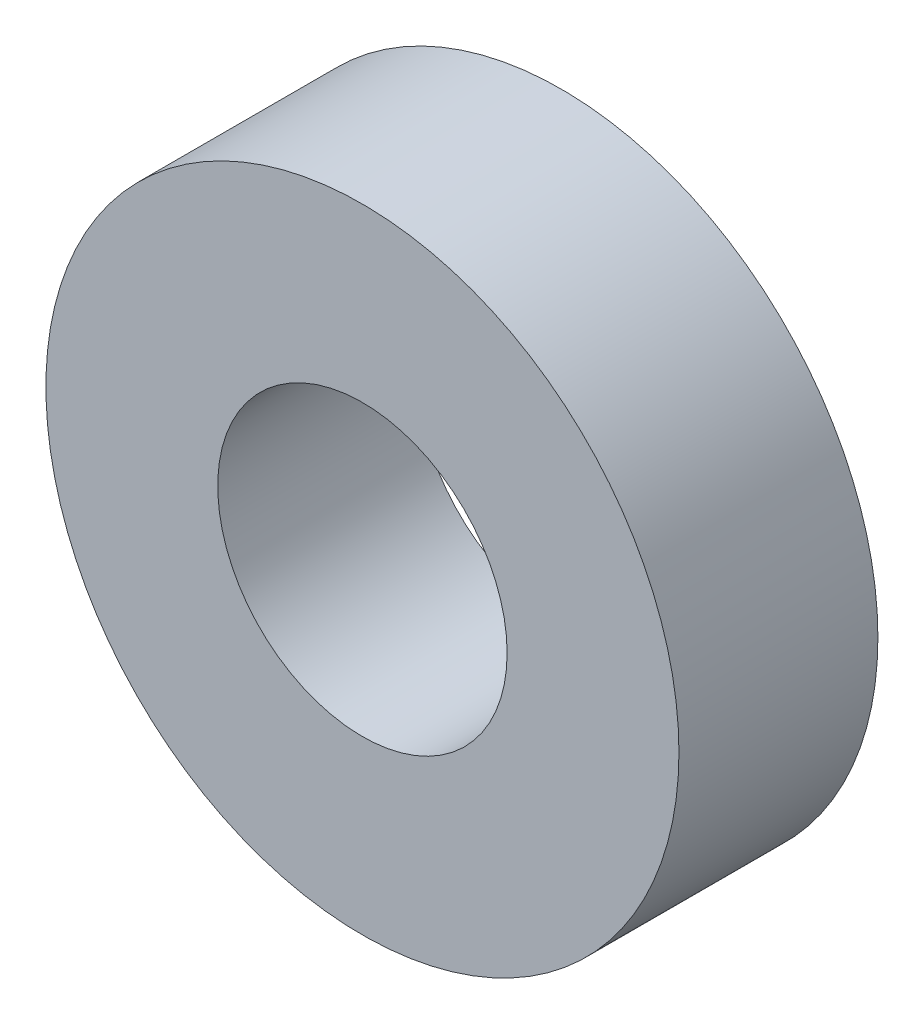
ISO-10303-21;
HEADER;
FILE_DESCRIPTION(('STEP AP214'),'2;1');
FILE_NAME('part.step','',(''),(''),'','','');
FILE_SCHEMA(('AUTOMOTIVE_DESIGN { 1 0 10303 214 1 1 1 1 }'));
ENDSEC;
DATA;
#1=APPLICATION_CONTEXT('core data for automotive mechanical design processes');
#2=APPLICATION_PROTOCOL_DEFINITION('international standard','automotive_design',2000,#1);
#3=PRODUCT_CONTEXT('',#1,'mechanical');
#4=PRODUCT('Part','Part','',(#3));
#5=PRODUCT_RELATED_PRODUCT_CATEGORY('part','',(#4));
#6=PRODUCT_DEFINITION_FORMATION('','',#4);
#7=PRODUCT_DEFINITION_CONTEXT('part definition',#1,'design');
#8=PRODUCT_DEFINITION('design','',#6,#7);
#9=PRODUCT_DEFINITION_SHAPE('','',#8);
#10=(LENGTH_UNIT() NAMED_UNIT(*) SI_UNIT(.MILLI.,.METRE.));
#11=(NAMED_UNIT(*) PLANE_ANGLE_UNIT() SI_UNIT($,.RADIAN.));
#12=(NAMED_UNIT(*) SI_UNIT($,.STERADIAN.) SOLID_ANGLE_UNIT());
#13=UNCERTAINTY_MEASURE_WITH_UNIT(LENGTH_MEASURE(1.E-05),#10,'distance_accuracy_value','');
#14=(GEOMETRIC_REPRESENTATION_CONTEXT(3) GLOBAL_UNCERTAINTY_ASSIGNED_CONTEXT((#13)) GLOBAL_UNIT_ASSIGNED_CONTEXT((#10,
#11,#12)) REPRESENTATION_CONTEXT('',''));
#15=CARTESIAN_POINT('',(0.,0.,0.));
#16=DIRECTION('',(0.,0.,1.));
#17=DIRECTION('',(1.,0.,0.));
#18=AXIS2_PLACEMENT_3D('',#15,#16,#17);
#19=CARTESIAN_POINT('',(0.,0.,11.));
#20=DIRECTION('',(0.,0.,1.));
#21=DIRECTION('',(1.,0.,0.));
#22=AXIS2_PLACEMENT_3D('',#19,#20,#21);
#23=PLANE('',#22);
#24=CARTESIAN_POINT('',(0.,0.,11.));
#25=DIRECTION('',(0.,0.,1.));
#26=DIRECTION('',(1.,0.,0.));
#27=AXIS2_PLACEMENT_3D('',#24,#25,#26);
#28=CIRCLE('',#27,17.5);
#29=CARTESIAN_POINT('',(17.5,0.,11.));
#30=VERTEX_POINT('',#29);
#31=EDGE_CURVE('E12',#30,#30,#28,.T.);
#32=ORIENTED_EDGE('',*,*,#31,.T.);
#33=EDGE_LOOP('',(#32));
#34=FACE_BOUND('',#33,.T.);
#35=CARTESIAN_POINT('',(0.,0.,11.));
#36=DIRECTION('',(0.,0.,1.));
#37=DIRECTION('',(1.,0.,0.));
#38=AXIS2_PLACEMENT_3D('',#35,#36,#37);
#39=CIRCLE('',#38,8.);
#40=CARTESIAN_POINT('',(8.,0.,11.));
#41=VERTEX_POINT('',#40);
#42=EDGE_CURVE('E53',#41,#41,#39,.T.);
#43=ORIENTED_EDGE('',*,*,#42,.F.);
#44=EDGE_LOOP('',(#43));
#45=FACE_BOUND('',#44,.T.);
#46=ADVANCED_FACE('F42',(#34,#45),#23,.T.);
#47=CARTESIAN_POINT('',(0.,0.,0.));
#48=DIRECTION('',(0.,0.,1.));
#49=DIRECTION('',(1.,0.,0.));
#50=AXIS2_PLACEMENT_3D('',#47,#48,#49);
#51=PLANE('',#50);
#52=CARTESIAN_POINT('',(0.,0.,0.));
#53=DIRECTION('',(0.,0.,1.));
#54=DIRECTION('',(1.,0.,0.));
#55=AXIS2_PLACEMENT_3D('',#52,#53,#54);
#56=CIRCLE('',#55,17.5);
#57=CARTESIAN_POINT('',(17.5,0.,0.));
#58=VERTEX_POINT('',#57);
#59=EDGE_CURVE('E46',#58,#58,#56,.T.);
#60=ORIENTED_EDGE('',*,*,#59,.F.);
#61=EDGE_LOOP('',(#60));
#62=FACE_BOUND('',#61,.T.);
#63=CARTESIAN_POINT('',(0.,0.,0.));
#64=DIRECTION('',(0.,0.,1.));
#65=DIRECTION('',(1.,0.,0.));
#66=AXIS2_PLACEMENT_3D('',#63,#64,#65);
#67=CIRCLE('',#66,8.);
#68=CARTESIAN_POINT('',(8.,0.,0.));
#69=VERTEX_POINT('',#68);
#70=EDGE_CURVE('E55',#69,#69,#67,.T.);
#71=ORIENTED_EDGE('',*,*,#70,.T.);
#72=EDGE_LOOP('',(#71));
#73=FACE_BOUND('',#72,.T.);
#74=ADVANCED_FACE('F65',(#62,#73),#51,.F.);
#75=CARTESIAN_POINT('',(0.,0.,11.));
#76=DIRECTION('',(0.,0.,-1.));
#77=DIRECTION('',(-1.,0.,0.));
#78=AXIS2_PLACEMENT_3D('',#75,#76,#77);
#79=CYLINDRICAL_SURFACE('',#78,17.5);
#80=ORIENTED_EDGE('',*,*,#31,.F.);
#81=EDGE_LOOP('',(#80));
#82=FACE_BOUND('',#81,.T.);
#83=ORIENTED_EDGE('',*,*,#59,.T.);
#84=EDGE_LOOP('',(#83));
#85=FACE_BOUND('',#84,.T.);
#86=ADVANCED_FACE('F44',(#82,#85),#79,.T.);
#87=CARTESIAN_POINT('',(0.,0.,11.));
#88=DIRECTION('',(0.,0.,-1.));
#89=DIRECTION('',(-1.,0.,0.));
#90=AXIS2_PLACEMENT_3D('',#87,#88,#89);
#91=CYLINDRICAL_SURFACE('',#90,8.);
#92=ORIENTED_EDGE('',*,*,#42,.T.);
#93=EDGE_LOOP('',(#92));
#94=FACE_BOUND('',#93,.T.);
#95=ORIENTED_EDGE('',*,*,#70,.F.);
#96=EDGE_LOOP('',(#95));
#97=FACE_BOUND('',#96,.T.);
#98=ADVANCED_FACE('F61',(#94,#97),#91,.F.);
#99=CLOSED_SHELL('',(#46,#74,#86,#98));
#100=MANIFOLD_SOLID_BREP('B2',#99);
#101=ADVANCED_BREP_SHAPE_REPRESENTATION('',(#18,#100),#14);
#102=SHAPE_DEFINITION_REPRESENTATION(#9,#101);
ENDSEC;
END-ISO-10303-21;
